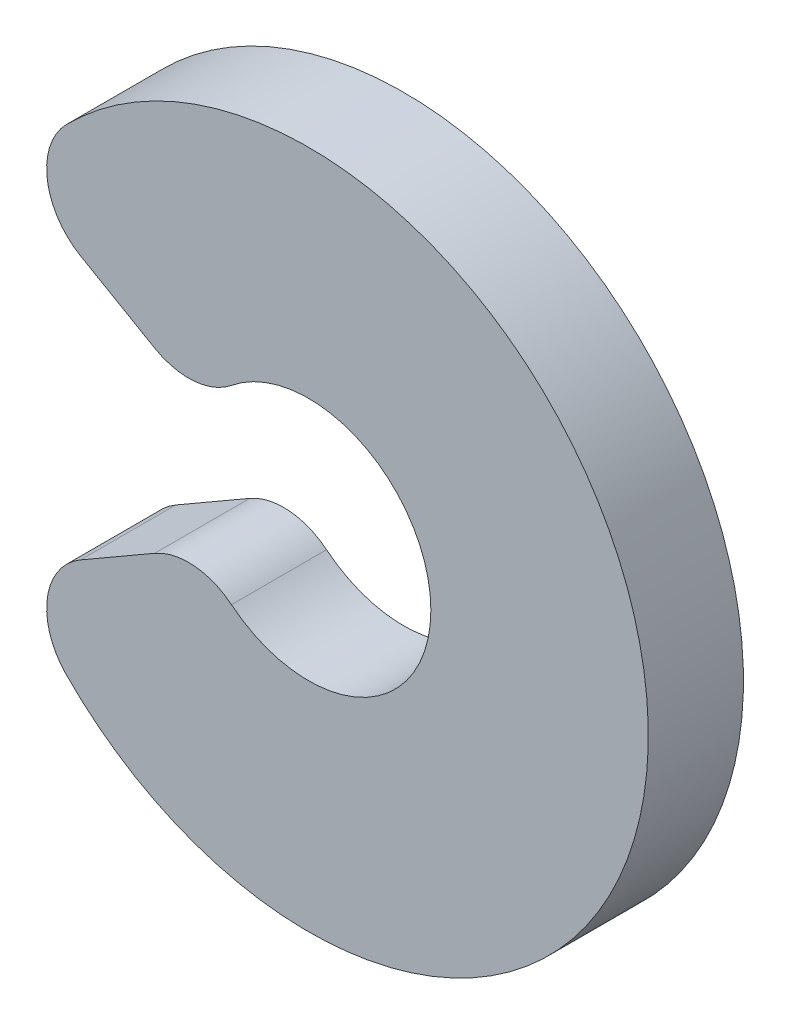
ISO-10303-21;
HEADER;
FILE_DESCRIPTION(('STEP AP214'),'2;1');
FILE_NAME('part.step','',(''),(''),'','','');
FILE_SCHEMA(('AUTOMOTIVE_DESIGN { 1 0 10303 214 1 1 1 1 }'));
ENDSEC;
DATA;
#1=APPLICATION_CONTEXT('core data for automotive mechanical design processes');
#2=APPLICATION_PROTOCOL_DEFINITION('international standard','automotive_design',2000,#1);
#3=PRODUCT_CONTEXT('',#1,'mechanical');
#4=PRODUCT('Part','Part','',(#3));
#5=PRODUCT_RELATED_PRODUCT_CATEGORY('part','',(#4));
#6=PRODUCT_DEFINITION_FORMATION('','',#4);
#7=PRODUCT_DEFINITION_CONTEXT('part definition',#1,'design');
#8=PRODUCT_DEFINITION('design','',#6,#7);
#9=PRODUCT_DEFINITION_SHAPE('','',#8);
#10=(LENGTH_UNIT() NAMED_UNIT(*) SI_UNIT(.MILLI.,.METRE.));
#11=(NAMED_UNIT(*) PLANE_ANGLE_UNIT() SI_UNIT($,.RADIAN.));
#12=(NAMED_UNIT(*) SI_UNIT($,.STERADIAN.) SOLID_ANGLE_UNIT());
#13=UNCERTAINTY_MEASURE_WITH_UNIT(LENGTH_MEASURE(1.E-05),#10,'distance_accuracy_value','');
#14=(GEOMETRIC_REPRESENTATION_CONTEXT(3) GLOBAL_UNCERTAINTY_ASSIGNED_CONTEXT((#13)) GLOBAL_UNIT_ASSIGNED_CONTEXT((#10,
#11,#12)) REPRESENTATION_CONTEXT('',''));
#15=CARTESIAN_POINT('',(0.,0.,0.));
#16=DIRECTION('',(0.,0.,1.));
#17=DIRECTION('',(1.,0.,0.));
#18=AXIS2_PLACEMENT_3D('',#15,#16,#17);
#19=CARTESIAN_POINT('',(0.,0.,1.4));
#20=DIRECTION('',(0.500000000000001,-0.866025403784438,0.));
#21=DIRECTION('',(0.866025403784438,0.500000000000001,0.));
#22=AXIS2_PLACEMENT_3D('',#19,#20,#21);
#23=PLANE('',#22);
#24=DIRECTION('',(-0.866025403784438,-0.500000000000001,0.));
#25=VECTOR('',#24,1.);
#26=CARTESIAN_POINT('',(0.,0.,0.));
#27=LINE('',#26,#25);
#28=CARTESIAN_POINT('',(-2.26495033058122,-1.3076696830622,0.));
#29=VERTEX_POINT('',#28);
#30=CARTESIAN_POINT('',(-3.35410196624968,-1.93649167310371,0.));
#31=VERTEX_POINT('',#30);
#32=EDGE_CURVE('E163',#29,#31,#27,.T.);
#33=ORIENTED_EDGE('',*,*,#32,.T.);
#34=DIRECTION('',(0.,0.,-1.));
#35=VECTOR('',#34,1.);
#36=CARTESIAN_POINT('',(-3.35410196624968,-1.93649167310371,1.4));
#37=LINE('',#36,#35);
#38=CARTESIAN_POINT('',(-3.35410196624968,-1.93649167310371,1.4));
#39=VERTEX_POINT('',#38);
#40=EDGE_CURVE('E154',#31,#39,#37,.F.);
#41=ORIENTED_EDGE('',*,*,#40,.T.);
#42=DIRECTION('',(-0.866025403784438,-0.500000000000001,0.));
#43=VECTOR('',#42,1.);
#44=CARTESIAN_POINT('',(0.,0.,1.4));
#45=LINE('',#44,#43);
#46=CARTESIAN_POINT('',(-2.26495033058122,-1.3076696830622,1.4));
#47=VERTEX_POINT('',#46);
#48=EDGE_CURVE('E160',#47,#39,#45,.T.);
#49=ORIENTED_EDGE('',*,*,#48,.F.);
#50=DIRECTION('',(0.,0.,1.));
#51=VECTOR('',#50,1.);
#52=CARTESIAN_POINT('',(-2.26495033058122,-1.3076696830622,0.));
#53=LINE('',#52,#51);
#54=EDGE_CURVE('E151',#47,#29,#53,.F.);
#55=ORIENTED_EDGE('',*,*,#54,.T.);
#56=EDGE_LOOP('',(#33,#41,#49,#55));
#57=FACE_BOUND('',#56,.T.);
#58=ADVANCED_FACE('F41',(#57),#23,.F.);
#59=CARTESIAN_POINT('',(0.,0.,1.4));
#60=DIRECTION('',(0.,0.,-1.));
#61=DIRECTION('',(-1.,0.,0.));
#62=AXIS2_PLACEMENT_3D('',#59,#60,#61);
#63=CYLINDRICAL_SURFACE('',#62,5.);
#64=CARTESIAN_POINT('',(0.,0.,0.));
#65=DIRECTION('',(0.,0.,1.));
#66=DIRECTION('',(1.,0.,0.));
#67=AXIS2_PLACEMENT_3D('',#64,#65,#66);
#68=CIRCLE('',#67,5.);
#69=CARTESIAN_POINT('',(-3.5676274578121,-3.50314634611019,0.));
#70=VERTEX_POINT('',#69);
#71=CARTESIAN_POINT('',(-3.56762745781211,3.50314634611018,0.));
#72=VERTEX_POINT('',#71);
#73=EDGE_CURVE('E125',#70,#72,#68,.T.);
#74=ORIENTED_EDGE('',*,*,#73,.T.);
#75=DIRECTION('',(0.,0.,-1.));
#76=VECTOR('',#75,1.);
#77=CARTESIAN_POINT('',(-3.56762745781211,3.50314634611018,1.4));
#78=LINE('',#77,#76);
#79=CARTESIAN_POINT('',(-3.56762745781211,3.50314634611018,1.4));
#80=VERTEX_POINT('',#79);
#81=EDGE_CURVE('E142',#72,#80,#78,.F.);
#82=ORIENTED_EDGE('',*,*,#81,.T.);
#83=CARTESIAN_POINT('',(0.,0.,1.4));
#84=DIRECTION('',(0.,0.,1.));
#85=DIRECTION('',(1.,0.,0.));
#86=AXIS2_PLACEMENT_3D('',#83,#84,#85);
#87=CIRCLE('',#86,5.);
#88=CARTESIAN_POINT('',(-3.5676274578121,-3.50314634611019,1.4));
#89=VERTEX_POINT('',#88);
#90=EDGE_CURVE('E170',#89,#80,#87,.T.);
#91=ORIENTED_EDGE('',*,*,#90,.F.);
#92=DIRECTION('',(0.,0.,-1.));
#93=VECTOR('',#92,1.);
#94=CARTESIAN_POINT('',(-3.5676274578121,-3.50314634611019,1.4));
#95=LINE('',#94,#93);
#96=EDGE_CURVE('E139',#89,#70,#95,.T.);
#97=ORIENTED_EDGE('',*,*,#96,.T.);
#98=EDGE_LOOP('',(#74,#82,#91,#97));
#99=FACE_BOUND('',#98,.T.);
#100=ADVANCED_FACE('F177',(#99),#63,.T.);
#101=CARTESIAN_POINT('',(0.,0.,1.4));
#102=DIRECTION('',(-0.5,-0.866025403784439,0.));
#103=DIRECTION('',(0.866025403784439,-0.5,0.));
#104=AXIS2_PLACEMENT_3D('',#101,#102,#103);
#105=PLANE('',#104);
#106=DIRECTION('',(-0.866025403784439,0.5,0.));
#107=VECTOR('',#106,1.);
#108=CARTESIAN_POINT('',(0.,0.,1.4));
#109=LINE('',#108,#107);
#110=CARTESIAN_POINT('',(-2.26495033058123,1.3076696830622,1.4));
#111=VERTEX_POINT('',#110);
#112=CARTESIAN_POINT('',(-3.35410196624969,1.93649167310371,1.4));
#113=VERTEX_POINT('',#112);
#114=EDGE_CURVE('E131',#111,#113,#109,.T.);
#115=ORIENTED_EDGE('',*,*,#114,.T.);
#116=DIRECTION('',(0.,0.,1.));
#117=VECTOR('',#116,1.);
#118=CARTESIAN_POINT('',(-3.35410196624968,1.93649167310371,0.));
#119=LINE('',#118,#117);
#120=CARTESIAN_POINT('',(-3.35410196624969,1.93649167310371,0.));
#121=VERTEX_POINT('',#120);
#122=EDGE_CURVE('E124',#113,#121,#119,.F.);
#123=ORIENTED_EDGE('',*,*,#122,.T.);
#124=DIRECTION('',(-0.866025403784439,0.5,0.));
#125=VECTOR('',#124,1.);
#126=CARTESIAN_POINT('',(0.,0.,0.));
#127=LINE('',#126,#125);
#128=CARTESIAN_POINT('',(-2.26495033058123,1.3076696830622,0.));
#129=VERTEX_POINT('',#128);
#130=EDGE_CURVE('E110',#129,#121,#127,.T.);
#131=ORIENTED_EDGE('',*,*,#130,.F.);
#132=DIRECTION('',(0.,0.,-1.));
#133=VECTOR('',#132,1.);
#134=CARTESIAN_POINT('',(-2.26495033058123,1.3076696830622,1.4));
#135=LINE('',#134,#133);
#136=EDGE_CURVE('E122',#129,#111,#135,.F.);
#137=ORIENTED_EDGE('',*,*,#136,.T.);
#138=EDGE_LOOP('',(#115,#123,#131,#137));
#139=FACE_BOUND('',#138,.T.);
#140=ADVANCED_FACE('F121',(#139),#105,.T.);
#141=CARTESIAN_POINT('',(0.,0.,1.4));
#142=DIRECTION('',(0.,0.,-1.));
#143=DIRECTION('',(-1.,0.,0.));
#144=AXIS2_PLACEMENT_3D('',#141,#142,#143);
#145=CYLINDRICAL_SURFACE('',#144,1.8);
#146=CARTESIAN_POINT('',(0.,0.,1.4));
#147=DIRECTION('',(0.,0.,1.));
#148=DIRECTION('',(1.,0.,0.));
#149=AXIS2_PLACEMENT_3D('',#146,#147,#148);
#150=CIRCLE('',#149,1.8);
#151=CARTESIAN_POINT('',(-1.13461092680221,-1.39737541297284,1.4));
#152=VERTEX_POINT('',#151);
#153=CARTESIAN_POINT('',(-1.13461092680222,1.39737541297284,1.4));
#154=VERTEX_POINT('',#153);
#155=EDGE_CURVE('E128',#152,#154,#150,.T.);
#156=ORIENTED_EDGE('',*,*,#155,.T.);
#157=DIRECTION('',(0.,0.,-1.));
#158=VECTOR('',#157,1.);
#159=CARTESIAN_POINT('',(-1.13461092680222,1.39737541297284,1.4));
#160=LINE('',#159,#158);
#161=CARTESIAN_POINT('',(-1.13461092680222,1.39737541297284,0.));
#162=VERTEX_POINT('',#161);
#163=EDGE_CURVE('E11',#154,#162,#160,.T.);
#164=ORIENTED_EDGE('',*,*,#163,.T.);
#165=CARTESIAN_POINT('',(0.,0.,0.));
#166=DIRECTION('',(0.,0.,1.));
#167=DIRECTION('',(1.,0.,0.));
#168=AXIS2_PLACEMENT_3D('',#165,#166,#167);
#169=CIRCLE('',#168,1.8);
#170=CARTESIAN_POINT('',(-1.13461092680221,-1.39737541297284,0.));
#171=VERTEX_POINT('',#170);
#172=EDGE_CURVE('E111',#171,#162,#169,.T.);
#173=ORIENTED_EDGE('',*,*,#172,.F.);
#174=DIRECTION('',(0.,0.,-1.));
#175=VECTOR('',#174,1.);
#176=CARTESIAN_POINT('',(-1.13461092680221,-1.39737541297284,1.4));
#177=LINE('',#176,#175);
#178=EDGE_CURVE('E49',#171,#152,#177,.F.);
#179=ORIENTED_EDGE('',*,*,#178,.T.);
#180=EDGE_LOOP('',(#156,#164,#173,#179));
#181=FACE_BOUND('',#180,.T.);
#182=ADVANCED_FACE('F203',(#181),#145,.F.);
#183=CARTESIAN_POINT('',(0.,0.,1.4));
#184=DIRECTION('',(0.,0.,1.));
#185=DIRECTION('',(1.,0.,0.));
#186=AXIS2_PLACEMENT_3D('',#183,#184,#185);
#187=PLANE('',#186);
#188=ORIENTED_EDGE('',*,*,#90,.T.);
#189=CARTESIAN_POINT('',(-2.85410196624968,2.80251707688815,1.4));
#190=DIRECTION('',(0.,0.,1.));
#191=DIRECTION('',(1.,0.,0.));
#192=AXIS2_PLACEMENT_3D('',#189,#190,#191);
#193=CIRCLE('',#192,1.);
#194=EDGE_CURVE('E149',#80,#113,#193,.T.);
#195=ORIENTED_EDGE('',*,*,#194,.T.);
#196=ORIENTED_EDGE('',*,*,#114,.F.);
#197=CARTESIAN_POINT('',(-1.76495033058123,2.17369508684664,1.4));
#198=DIRECTION('',(0.,0.,1.));
#199=DIRECTION('',(1.,0.,0.));
#200=AXIS2_PLACEMENT_3D('',#197,#198,#199);
#201=CIRCLE('',#200,1.);
#202=EDGE_CURVE('E56',#111,#154,#201,.T.);
#203=ORIENTED_EDGE('',*,*,#202,.T.);
#204=ORIENTED_EDGE('',*,*,#155,.F.);
#205=CARTESIAN_POINT('',(-1.76495033058122,-2.17369508684664,1.4));
#206=DIRECTION('',(0.,0.,1.));
#207=DIRECTION('',(1.,0.,0.));
#208=AXIS2_PLACEMENT_3D('',#205,#206,#207);
#209=CIRCLE('',#208,1.);
#210=EDGE_CURVE('E144',#152,#47,#209,.T.);
#211=ORIENTED_EDGE('',*,*,#210,.T.);
#212=ORIENTED_EDGE('',*,*,#48,.T.);
#213=CARTESIAN_POINT('',(-2.85410196624968,-2.80251707688815,1.4));
#214=DIRECTION('',(0.,0.,1.));
#215=DIRECTION('',(1.,0.,0.));
#216=AXIS2_PLACEMENT_3D('',#213,#214,#215);
#217=CIRCLE('',#216,1.);
#218=EDGE_CURVE('E147',#39,#89,#217,.T.);
#219=ORIENTED_EDGE('',*,*,#218,.T.);
#220=EDGE_LOOP('',(#188,#195,#196,#203,#204,#211,#212,#219));
#221=FACE_BOUND('',#220,.T.);
#222=ADVANCED_FACE('F167',(#221),#187,.T.);
#223=CARTESIAN_POINT('',(0.,0.,0.));
#224=DIRECTION('',(0.,0.,1.));
#225=DIRECTION('',(1.,0.,0.));
#226=AXIS2_PLACEMENT_3D('',#223,#224,#225);
#227=PLANE('',#226);
#228=ORIENTED_EDGE('',*,*,#130,.T.);
#229=CARTESIAN_POINT('',(-2.85410196624968,2.80251707688815,0.));
#230=DIRECTION('',(0.,0.,1.));
#231=DIRECTION('',(1.,0.,0.));
#232=AXIS2_PLACEMENT_3D('',#229,#230,#231);
#233=CIRCLE('',#232,1.);
#234=EDGE_CURVE('E137',#121,#72,#233,.F.);
#235=ORIENTED_EDGE('',*,*,#234,.T.);
#236=ORIENTED_EDGE('',*,*,#73,.F.);
#237=CARTESIAN_POINT('',(-2.85410196624968,-2.80251707688815,0.));
#238=DIRECTION('',(0.,0.,1.));
#239=DIRECTION('',(1.,0.,0.));
#240=AXIS2_PLACEMENT_3D('',#237,#238,#239);
#241=CIRCLE('',#240,1.);
#242=EDGE_CURVE('E115',#70,#31,#241,.F.);
#243=ORIENTED_EDGE('',*,*,#242,.T.);
#244=ORIENTED_EDGE('',*,*,#32,.F.);
#245=CARTESIAN_POINT('',(-1.76495033058122,-2.17369508684664,0.));
#246=DIRECTION('',(0.,0.,1.));
#247=DIRECTION('',(1.,0.,0.));
#248=AXIS2_PLACEMENT_3D('',#245,#246,#247);
#249=CIRCLE('',#248,1.);
#250=EDGE_CURVE('E116',#29,#171,#249,.F.);
#251=ORIENTED_EDGE('',*,*,#250,.T.);
#252=ORIENTED_EDGE('',*,*,#172,.T.);
#253=CARTESIAN_POINT('',(-1.76495033058123,2.17369508684664,0.));
#254=DIRECTION('',(0.,0.,1.));
#255=DIRECTION('',(1.,0.,0.));
#256=AXIS2_PLACEMENT_3D('',#253,#254,#255);
#257=CIRCLE('',#256,1.);
#258=EDGE_CURVE('E107',#162,#129,#257,.F.);
#259=ORIENTED_EDGE('',*,*,#258,.T.);
#260=EDGE_LOOP('',(#228,#235,#236,#243,#244,#251,#252,#259));
#261=FACE_BOUND('',#260,.T.);
#262=ADVANCED_FACE('F109',(#261),#227,.F.);
#263=CARTESIAN_POINT('',(-2.85410196624968,2.80251707688815,1.4));
#264=DIRECTION('',(0.,0.,-1.));
#265=DIRECTION('',(-1.,0.,0.));
#266=AXIS2_PLACEMENT_3D('',#263,#264,#265);
#267=CYLINDRICAL_SURFACE('',#266,1.);
#268=ORIENTED_EDGE('',*,*,#194,.F.);
#269=ORIENTED_EDGE('',*,*,#81,.F.);
#270=ORIENTED_EDGE('',*,*,#234,.F.);
#271=ORIENTED_EDGE('',*,*,#122,.F.);
#272=EDGE_LOOP('',(#268,#269,#270,#271));
#273=FACE_BOUND('',#272,.T.);
#274=ADVANCED_FACE('F185',(#273),#267,.T.);
#275=CARTESIAN_POINT('',(-2.85410196624968,-2.80251707688815,1.4));
#276=DIRECTION('',(0.,0.,-1.));
#277=DIRECTION('',(-1.,0.,0.));
#278=AXIS2_PLACEMENT_3D('',#275,#276,#277);
#279=CYLINDRICAL_SURFACE('',#278,1.);
#280=ORIENTED_EDGE('',*,*,#218,.F.);
#281=ORIENTED_EDGE('',*,*,#40,.F.);
#282=ORIENTED_EDGE('',*,*,#242,.F.);
#283=ORIENTED_EDGE('',*,*,#96,.F.);
#284=EDGE_LOOP('',(#280,#281,#282,#283));
#285=FACE_BOUND('',#284,.T.);
#286=ADVANCED_FACE('F173',(#285),#279,.T.);
#287=CARTESIAN_POINT('',(-1.76495033058123,2.17369508684664,1.4));
#288=DIRECTION('',(0.,0.,-1.));
#289=DIRECTION('',(-1.,0.,0.));
#290=AXIS2_PLACEMENT_3D('',#287,#288,#289);
#291=CYLINDRICAL_SURFACE('',#290,1.);
#292=ORIENTED_EDGE('',*,*,#202,.F.);
#293=ORIENTED_EDGE('',*,*,#136,.F.);
#294=ORIENTED_EDGE('',*,*,#258,.F.);
#295=ORIENTED_EDGE('',*,*,#163,.F.);
#296=EDGE_LOOP('',(#292,#293,#294,#295));
#297=FACE_BOUND('',#296,.T.);
#298=ADVANCED_FACE('F127',(#297),#291,.T.);
#299=CARTESIAN_POINT('',(-1.76495033058122,-2.17369508684664,1.4));
#300=DIRECTION('',(0.,0.,-1.));
#301=DIRECTION('',(-1.,0.,0.));
#302=AXIS2_PLACEMENT_3D('',#299,#300,#301);
#303=CYLINDRICAL_SURFACE('',#302,1.);
#304=ORIENTED_EDGE('',*,*,#210,.F.);
#305=ORIENTED_EDGE('',*,*,#178,.F.);
#306=ORIENTED_EDGE('',*,*,#250,.F.);
#307=ORIENTED_EDGE('',*,*,#54,.F.);
#308=EDGE_LOOP('',(#304,#305,#306,#307));
#309=FACE_BOUND('',#308,.T.);
#310=ADVANCED_FACE('F43',(#309),#303,.T.);
#311=CLOSED_SHELL('',(#58,#100,#140,#182,#222,#262,#274,#286,#298,#310));
#312=MANIFOLD_SOLID_BREP('B2',#311);
#313=ADVANCED_BREP_SHAPE_REPRESENTATION('',(#18,#312),#14);
#314=SHAPE_DEFINITION_REPRESENTATION(#9,#313);
ENDSEC;
END-ISO-10303-21;
